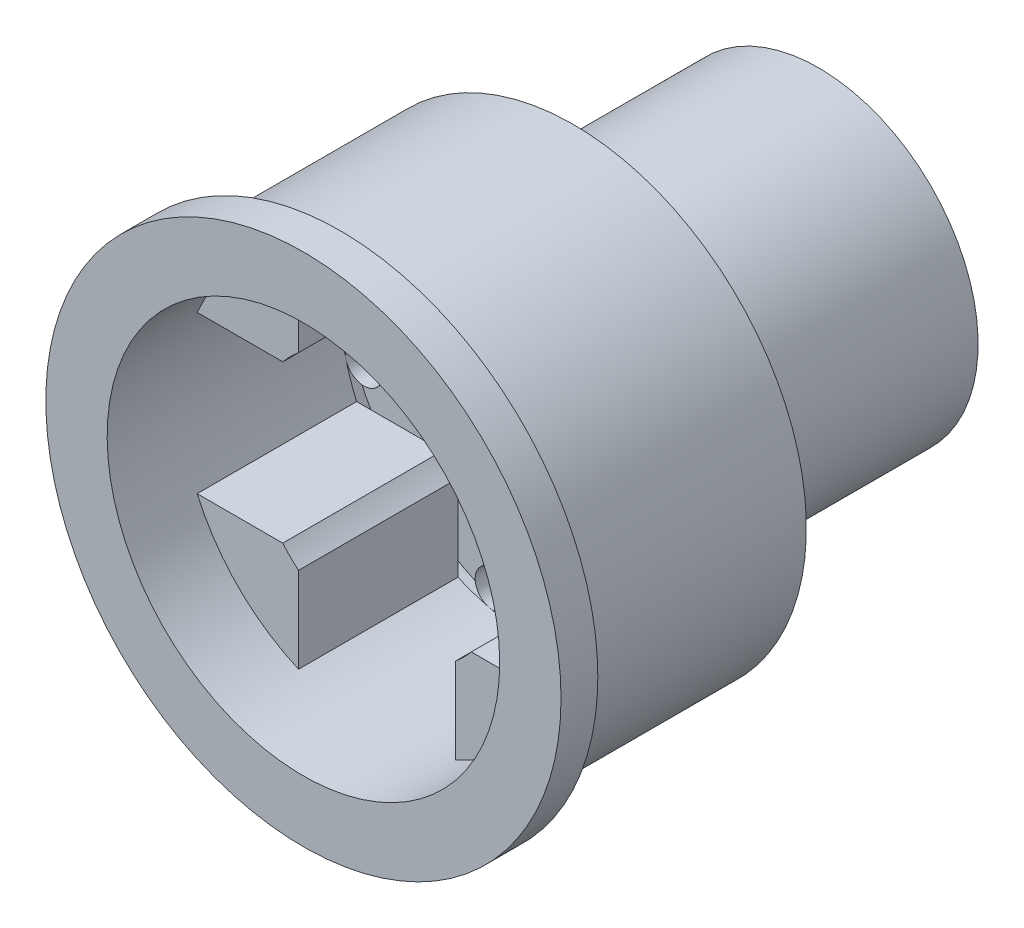
ISO-10303-21;
HEADER;
FILE_DESCRIPTION(('STEP AP214'),'2;1');
FILE_NAME('part.step','',(''),(''),'','','');
FILE_SCHEMA(('AUTOMOTIVE_DESIGN { 1 0 10303 214 1 1 1 1 }'));
ENDSEC;
DATA;
#1=APPLICATION_CONTEXT('core data for automotive mechanical design processes');
#2=APPLICATION_PROTOCOL_DEFINITION('international standard','automotive_design',2000,#1);
#3=PRODUCT_CONTEXT('',#1,'mechanical');
#4=PRODUCT('Part','Part','',(#3));
#5=PRODUCT_RELATED_PRODUCT_CATEGORY('part','',(#4));
#6=PRODUCT_DEFINITION_FORMATION('','',#4);
#7=PRODUCT_DEFINITION_CONTEXT('part definition',#1,'design');
#8=PRODUCT_DEFINITION('design','',#6,#7);
#9=PRODUCT_DEFINITION_SHAPE('','',#8);
#10=(LENGTH_UNIT() NAMED_UNIT(*) SI_UNIT(.MILLI.,.METRE.));
#11=(NAMED_UNIT(*) PLANE_ANGLE_UNIT() SI_UNIT($,.RADIAN.));
#12=(NAMED_UNIT(*) SI_UNIT($,.STERADIAN.) SOLID_ANGLE_UNIT());
#13=UNCERTAINTY_MEASURE_WITH_UNIT(LENGTH_MEASURE(1.E-05),#10,'distance_accuracy_value','');
#14=(GEOMETRIC_REPRESENTATION_CONTEXT(3) GLOBAL_UNCERTAINTY_ASSIGNED_CONTEXT((#13)) GLOBAL_UNIT_ASSIGNED_CONTEXT((#10,
#11,#12)) REPRESENTATION_CONTEXT('',''));
#15=CARTESIAN_POINT('',(0.,0.,0.));
#16=DIRECTION('',(0.,0.,1.));
#17=DIRECTION('',(1.,0.,0.));
#18=AXIS2_PLACEMENT_3D('',#15,#16,#17);
#19=CARTESIAN_POINT('',(0.,0.,-8.));
#20=DIRECTION('',(0.,0.,1.));
#21=DIRECTION('',(1.,0.,0.));
#22=AXIS2_PLACEMENT_3D('',#19,#20,#21);
#23=CYLINDRICAL_SURFACE('',#22,5.);
#24=CARTESIAN_POINT('',(0.,0.,-6.5));
#25=DIRECTION('',(0.,0.,-1.));
#26=DIRECTION('',(-1.,0.,0.));
#27=AXIS2_PLACEMENT_3D('',#24,#25,#26);
#28=CIRCLE('',#27,5.);
#29=CARTESIAN_POINT('',(-3.2,3.84187454245971,-6.5));
#30=VERTEX_POINT('',#29);
#31=CARTESIAN_POINT('',(3.2,3.84187454245971,-6.5));
#32=VERTEX_POINT('',#31);
#33=EDGE_CURVE('E341',#30,#32,#28,.T.);
#34=ORIENTED_EDGE('',*,*,#33,.F.);
#35=DIRECTION('',(0.,0.,-1.));
#36=VECTOR('',#35,1.);
#37=CARTESIAN_POINT('',(-3.2,3.84187454245971,3.));
#38=LINE('',#37,#36);
#39=CARTESIAN_POINT('',(-3.2,3.84187454245971,0.));
#40=VERTEX_POINT('',#39);
#41=EDGE_CURVE('E328',#30,#40,#38,.F.);
#42=ORIENTED_EDGE('',*,*,#41,.T.);
#43=CARTESIAN_POINT('',(0.,0.,0.));
#44=DIRECTION('',(0.,0.,-1.));
#45=DIRECTION('',(-1.,0.,0.));
#46=AXIS2_PLACEMENT_3D('',#43,#44,#45);
#47=CIRCLE('',#46,5.);
#48=CARTESIAN_POINT('',(-3.84187454245971,3.2,0.));
#49=VERTEX_POINT('',#48);
#50=EDGE_CURVE('E325',#49,#40,#47,.T.);
#51=ORIENTED_EDGE('',*,*,#50,.F.);
#52=DIRECTION('',(0.,0.,-1.));
#53=VECTOR('',#52,1.);
#54=CARTESIAN_POINT('',(-3.84187454245971,3.2,3.));
#55=LINE('',#54,#53);
#56=CARTESIAN_POINT('',(-3.84187454245971,3.2,-6.5));
#57=VERTEX_POINT('',#56);
#58=EDGE_CURVE('E323',#49,#57,#55,.T.);
#59=ORIENTED_EDGE('',*,*,#58,.T.);
#60=CARTESIAN_POINT('',(-3.84187454245971,-3.2,-6.5));
#61=VERTEX_POINT('',#60);
#62=EDGE_CURVE('E337',#61,#57,#28,.T.);
#63=ORIENTED_EDGE('',*,*,#62,.F.);
#64=DIRECTION('',(0.,0.,-1.));
#65=VECTOR('',#64,1.);
#66=CARTESIAN_POINT('',(-3.84187454245971,-3.2,3.));
#67=LINE('',#66,#65);
#68=CARTESIAN_POINT('',(-3.84187454245971,-3.2,0.));
#69=VERTEX_POINT('',#68);
#70=EDGE_CURVE('E319',#61,#69,#67,.F.);
#71=ORIENTED_EDGE('',*,*,#70,.T.);
#72=CARTESIAN_POINT('',(0.,0.,0.));
#73=DIRECTION('',(0.,0.,-1.));
#74=DIRECTION('',(-1.,0.,0.));
#75=AXIS2_PLACEMENT_3D('',#72,#73,#74);
#76=CIRCLE('',#75,5.);
#77=CARTESIAN_POINT('',(-3.2,-3.84187454245971,0.));
#78=VERTEX_POINT('',#77);
#79=EDGE_CURVE('E316',#78,#69,#76,.T.);
#80=ORIENTED_EDGE('',*,*,#79,.F.);
#81=DIRECTION('',(0.,0.,-1.));
#82=VECTOR('',#81,1.);
#83=CARTESIAN_POINT('',(-3.2,-3.84187454245971,3.));
#84=LINE('',#83,#82);
#85=CARTESIAN_POINT('',(-3.2,-3.84187454245971,-6.5));
#86=VERTEX_POINT('',#85);
#87=EDGE_CURVE('E304',#78,#86,#84,.T.);
#88=ORIENTED_EDGE('',*,*,#87,.T.);
#89=CARTESIAN_POINT('',(3.2,-3.84187454245971,-6.5));
#90=VERTEX_POINT('',#89);
#91=EDGE_CURVE('E340',#90,#86,#28,.T.);
#92=ORIENTED_EDGE('',*,*,#91,.F.);
#93=DIRECTION('',(0.,0.,-1.));
#94=VECTOR('',#93,1.);
#95=CARTESIAN_POINT('',(3.2,-3.84187454245971,3.));
#96=LINE('',#95,#94);
#97=CARTESIAN_POINT('',(3.2,-3.84187454245971,0.));
#98=VERTEX_POINT('',#97);
#99=EDGE_CURVE('E311',#90,#98,#96,.F.);
#100=ORIENTED_EDGE('',*,*,#99,.T.);
#101=CARTESIAN_POINT('',(0.,0.,0.));
#102=DIRECTION('',(0.,0.,-1.));
#103=DIRECTION('',(-1.,0.,0.));
#104=AXIS2_PLACEMENT_3D('',#101,#102,#103);
#105=CIRCLE('',#104,5.);
#106=CARTESIAN_POINT('',(3.84187454245971,-3.2,0.));
#107=VERTEX_POINT('',#106);
#108=EDGE_CURVE('E313',#107,#98,#105,.T.);
#109=ORIENTED_EDGE('',*,*,#108,.F.);
#110=DIRECTION('',(0.,0.,-1.));
#111=VECTOR('',#110,1.);
#112=CARTESIAN_POINT('',(3.84187454245971,-3.2,3.));
#113=LINE('',#112,#111);
#114=CARTESIAN_POINT('',(3.84187454245971,-3.2,-6.5));
#115=VERTEX_POINT('',#114);
#116=EDGE_CURVE('E321',#107,#115,#113,.T.);
#117=ORIENTED_EDGE('',*,*,#116,.T.);
#118=CARTESIAN_POINT('',(3.84187454245971,3.2,-6.5));
#119=VERTEX_POINT('',#118);
#120=EDGE_CURVE('E476',#119,#115,#28,.T.);
#121=ORIENTED_EDGE('',*,*,#120,.F.);
#122=DIRECTION('',(0.,0.,-1.));
#123=VECTOR('',#122,1.);
#124=CARTESIAN_POINT('',(3.84187454245971,3.2,3.));
#125=LINE('',#124,#123);
#126=CARTESIAN_POINT('',(3.84187454245971,3.2,0.));
#127=VERTEX_POINT('',#126);
#128=EDGE_CURVE('E335',#119,#127,#125,.F.);
#129=ORIENTED_EDGE('',*,*,#128,.T.);
#130=CARTESIAN_POINT('',(0.,0.,0.));
#131=DIRECTION('',(0.,0.,-1.));
#132=DIRECTION('',(-1.,0.,0.));
#133=AXIS2_PLACEMENT_3D('',#130,#131,#132);
#134=CIRCLE('',#133,5.);
#135=CARTESIAN_POINT('',(3.2,3.84187454245971,0.));
#136=VERTEX_POINT('',#135);
#137=EDGE_CURVE('E332',#136,#127,#134,.T.);
#138=ORIENTED_EDGE('',*,*,#137,.F.);
#139=DIRECTION('',(0.,0.,-1.));
#140=VECTOR('',#139,1.);
#141=CARTESIAN_POINT('',(3.2,3.84187454245971,3.));
#142=LINE('',#141,#140);
#143=EDGE_CURVE('E330',#136,#32,#142,.T.);
#144=ORIENTED_EDGE('',*,*,#143,.T.);
#145=EDGE_LOOP('',(#34,#42,#51,#59,#63,#71,#80,#88,#92,#100,#109,#117,#121,#129,#138,#144));
#146=FACE_BOUND('',#145,.T.);
#147=CARTESIAN_POINT('',(0.,0.,-16.5));
#148=DIRECTION('',(0.,0.,-1.));
#149=DIRECTION('',(-1.,0.,0.));
#150=AXIS2_PLACEMENT_3D('',#147,#148,#149);
#151=CIRCLE('',#150,5.);
#152=CARTESIAN_POINT('',(-5.,0.,-16.5));
#153=VERTEX_POINT('',#152);
#154=EDGE_CURVE('E261',#153,#153,#151,.T.);
#155=ORIENTED_EDGE('',*,*,#154,.T.);
#156=EDGE_LOOP('',(#155));
#157=FACE_BOUND('',#156,.T.);
#158=ADVANCED_FACE('F34',(#146,#157),#23,.F.);
#159=CARTESIAN_POINT('',(0.,0.,1.5));
#160=DIRECTION('',(0.,0.,-1.));
#161=DIRECTION('',(-1.,0.,0.));
#162=AXIS2_PLACEMENT_3D('',#159,#160,#161);
#163=CYLINDRICAL_SURFACE('',#162,9.5);
#164=CARTESIAN_POINT('',(0.,0.,1.5));
#165=DIRECTION('',(0.,0.,1.));
#166=DIRECTION('',(1.,0.,0.));
#167=AXIS2_PLACEMENT_3D('',#164,#165,#166);
#168=CIRCLE('',#167,9.5);
#169=CARTESIAN_POINT('',(9.5,0.,1.5));
#170=VERTEX_POINT('',#169);
#171=EDGE_CURVE('E38',#170,#170,#168,.T.);
#172=ORIENTED_EDGE('',*,*,#171,.F.);
#173=EDGE_LOOP('',(#172));
#174=FACE_BOUND('',#173,.T.);
#175=CARTESIAN_POINT('',(0.,0.,-8.));
#176=DIRECTION('',(0.,0.,-1.));
#177=DIRECTION('',(-1.,0.,0.));
#178=AXIS2_PLACEMENT_3D('',#175,#176,#177);
#179=CIRCLE('',#178,9.5);
#180=CARTESIAN_POINT('',(-9.5,0.,-8.));
#181=VERTEX_POINT('',#180);
#182=EDGE_CURVE('E342',#181,#181,#179,.T.);
#183=ORIENTED_EDGE('',*,*,#182,.F.);
#184=EDGE_LOOP('',(#183));
#185=FACE_BOUND('',#184,.T.);
#186=ADVANCED_FACE('F36',(#174,#185),#163,.T.);
#187=CARTESIAN_POINT('',(0.,0.,1.5));
#188=DIRECTION('',(0.,0.,-1.));
#189=DIRECTION('',(-1.,0.,0.));
#190=AXIS2_PLACEMENT_3D('',#187,#188,#189);
#191=CYLINDRICAL_SURFACE('',#190,8.);
#192=CARTESIAN_POINT('',(0.,0.,0.));
#193=DIRECTION('',(0.,0.,1.));
#194=DIRECTION('',(1.,0.,0.));
#195=AXIS2_PLACEMENT_3D('',#192,#193,#194);
#196=CIRCLE('',#195,8.);
#197=CARTESIAN_POINT('',(7.33212111192934,3.2,0.));
#198=VERTEX_POINT('',#197);
#199=CARTESIAN_POINT('',(3.2,7.33212111192934,0.));
#200=VERTEX_POINT('',#199);
#201=EDGE_CURVE('E442',#198,#200,#196,.T.);
#202=ORIENTED_EDGE('',*,*,#201,.F.);
#203=DIRECTION('',(0.,0.,1.));
#204=VECTOR('',#203,1.);
#205=CARTESIAN_POINT('',(7.33212111192934,3.2,-6.5));
#206=LINE('',#205,#204);
#207=CARTESIAN_POINT('',(7.33212111192934,3.2,-6.5));
#208=VERTEX_POINT('',#207);
#209=EDGE_CURVE('E390',#208,#198,#206,.T.);
#210=ORIENTED_EDGE('',*,*,#209,.F.);
#211=CARTESIAN_POINT('',(0.,0.,-6.5));
#212=DIRECTION('',(0.,0.,-1.));
#213=DIRECTION('',(-1.,0.,0.));
#214=AXIS2_PLACEMENT_3D('',#211,#212,#213);
#215=CIRCLE('',#214,8.);
#216=CARTESIAN_POINT('',(7.76344677488016,1.93103448275862,-6.5));
#217=VERTEX_POINT('',#216);
#218=EDGE_CURVE('E346',#208,#217,#215,.T.);
#219=ORIENTED_EDGE('',*,*,#218,.T.);
#220=CARTESIAN_POINT('',(7.76344677488016,-1.93103448275862,-6.5));
#221=VERTEX_POINT('',#220);
#222=EDGE_CURVE('E350',#217,#221,#215,.T.);
#223=ORIENTED_EDGE('',*,*,#222,.T.);
#224=CARTESIAN_POINT('',(7.33212111192934,-3.2,-6.5));
#225=VERTEX_POINT('',#224);
#226=EDGE_CURVE('E351',#221,#225,#215,.T.);
#227=ORIENTED_EDGE('',*,*,#226,.T.);
#228=DIRECTION('',(0.,0.,1.));
#229=VECTOR('',#228,1.);
#230=CARTESIAN_POINT('',(7.33212111192934,-3.2,-6.5));
#231=LINE('',#230,#229);
#232=CARTESIAN_POINT('',(7.33212111192934,-3.2,0.));
#233=VERTEX_POINT('',#232);
#234=EDGE_CURVE('E430',#225,#233,#231,.T.);
#235=ORIENTED_EDGE('',*,*,#234,.T.);
#236=CARTESIAN_POINT('',(3.2,-7.33212111192934,0.));
#237=VERTEX_POINT('',#236);
#238=EDGE_CURVE('E440',#237,#233,#196,.T.);
#239=ORIENTED_EDGE('',*,*,#238,.F.);
#240=DIRECTION('',(0.,0.,1.));
#241=VECTOR('',#240,1.);
#242=CARTESIAN_POINT('',(3.2,-7.33212111192934,-6.5));
#243=LINE('',#242,#241);
#244=CARTESIAN_POINT('',(3.2,-7.33212111192934,-6.5));
#245=VERTEX_POINT('',#244);
#246=EDGE_CURVE('E427',#245,#237,#243,.T.);
#247=ORIENTED_EDGE('',*,*,#246,.F.);
#248=CARTESIAN_POINT('',(0.,0.,-6.5));
#249=DIRECTION('',(0.,0.,-1.));
#250=DIRECTION('',(-1.,0.,0.));
#251=AXIS2_PLACEMENT_3D('',#248,#249,#250);
#252=CIRCLE('',#251,8.);
#253=CARTESIAN_POINT('',(1.9310344827587,-7.76344677488014,-6.5));
#254=VERTEX_POINT('',#253);
#255=EDGE_CURVE('E358',#245,#254,#252,.T.);
#256=ORIENTED_EDGE('',*,*,#255,.T.);
#257=CARTESIAN_POINT('',(-1.93103448275854,-7.76344677488018,-6.5));
#258=VERTEX_POINT('',#257);
#259=EDGE_CURVE('E362',#254,#258,#252,.T.);
#260=ORIENTED_EDGE('',*,*,#259,.T.);
#261=CARTESIAN_POINT('',(-3.2,-7.33212111192934,-6.5));
#262=VERTEX_POINT('',#261);
#263=EDGE_CURVE('E357',#258,#262,#252,.T.);
#264=ORIENTED_EDGE('',*,*,#263,.T.);
#265=DIRECTION('',(0.,0.,1.));
#266=VECTOR('',#265,1.);
#267=CARTESIAN_POINT('',(-3.2,-7.33212111192934,-6.5));
#268=LINE('',#267,#266);
#269=CARTESIAN_POINT('',(-3.2,-7.33212111192934,0.));
#270=VERTEX_POINT('',#269);
#271=EDGE_CURVE('E424',#262,#270,#268,.T.);
#272=ORIENTED_EDGE('',*,*,#271,.T.);
#273=CARTESIAN_POINT('',(-7.33212111192934,-3.2,0.));
#274=VERTEX_POINT('',#273);
#275=EDGE_CURVE('E447',#274,#270,#196,.T.);
#276=ORIENTED_EDGE('',*,*,#275,.F.);
#277=DIRECTION('',(0.,0.,1.));
#278=VECTOR('',#277,1.);
#279=CARTESIAN_POINT('',(-7.33212111192934,-3.2,-6.5));
#280=LINE('',#279,#278);
#281=CARTESIAN_POINT('',(-7.33212111192934,-3.2,-6.5));
#282=VERTEX_POINT('',#281);
#283=EDGE_CURVE('E421',#282,#274,#280,.T.);
#284=ORIENTED_EDGE('',*,*,#283,.F.);
#285=CARTESIAN_POINT('',(0.,0.,-6.5));
#286=DIRECTION('',(0.,0.,-1.));
#287=DIRECTION('',(-1.,0.,0.));
#288=AXIS2_PLACEMENT_3D('',#285,#286,#287);
#289=CIRCLE('',#288,8.);
#290=CARTESIAN_POINT('',(-7.76344677488016,-1.93103448275862,-6.5));
#291=VERTEX_POINT('',#290);
#292=EDGE_CURVE('E369',#282,#291,#289,.T.);
#293=ORIENTED_EDGE('',*,*,#292,.T.);
#294=CARTESIAN_POINT('',(-7.76344677488016,1.93103448275862,-6.5));
#295=VERTEX_POINT('',#294);
#296=EDGE_CURVE('E373',#291,#295,#289,.T.);
#297=ORIENTED_EDGE('',*,*,#296,.T.);
#298=CARTESIAN_POINT('',(-7.33212111192934,3.2,-6.5));
#299=VERTEX_POINT('',#298);
#300=EDGE_CURVE('E368',#295,#299,#289,.T.);
#301=ORIENTED_EDGE('',*,*,#300,.T.);
#302=DIRECTION('',(0.,0.,1.));
#303=VECTOR('',#302,1.);
#304=CARTESIAN_POINT('',(-7.33212111192934,3.2,-6.5));
#305=LINE('',#304,#303);
#306=CARTESIAN_POINT('',(-7.33212111192934,3.2,0.));
#307=VERTEX_POINT('',#306);
#308=EDGE_CURVE('E418',#299,#307,#305,.T.);
#309=ORIENTED_EDGE('',*,*,#308,.T.);
#310=CARTESIAN_POINT('',(-3.2,7.33212111192934,0.));
#311=VERTEX_POINT('',#310);
#312=EDGE_CURVE('E443',#311,#307,#196,.T.);
#313=ORIENTED_EDGE('',*,*,#312,.F.);
#314=DIRECTION('',(0.,0.,1.));
#315=VECTOR('',#314,1.);
#316=CARTESIAN_POINT('',(-3.2,7.33212111192934,-6.5));
#317=LINE('',#316,#315);
#318=CARTESIAN_POINT('',(-3.2,7.33212111192934,-6.5));
#319=VERTEX_POINT('',#318);
#320=EDGE_CURVE('E415',#319,#311,#317,.T.);
#321=ORIENTED_EDGE('',*,*,#320,.F.);
#322=CARTESIAN_POINT('',(0.,0.,-6.5));
#323=DIRECTION('',(0.,0.,-1.));
#324=DIRECTION('',(-1.,0.,0.));
#325=AXIS2_PLACEMENT_3D('',#322,#323,#324);
#326=CIRCLE('',#325,8.);
#327=CARTESIAN_POINT('',(-1.93103448275865,7.76344677488015,-6.5));
#328=VERTEX_POINT('',#327);
#329=EDGE_CURVE('E380',#319,#328,#326,.T.);
#330=ORIENTED_EDGE('',*,*,#329,.T.);
#331=CARTESIAN_POINT('',(1.93103448275859,7.76344677488017,-6.5));
#332=VERTEX_POINT('',#331);
#333=EDGE_CURVE('E384',#328,#332,#326,.T.);
#334=ORIENTED_EDGE('',*,*,#333,.T.);
#335=CARTESIAN_POINT('',(3.2,7.33212111192934,-6.5));
#336=VERTEX_POINT('',#335);
#337=EDGE_CURVE('E379',#332,#336,#326,.T.);
#338=ORIENTED_EDGE('',*,*,#337,.T.);
#339=DIRECTION('',(0.,0.,1.));
#340=VECTOR('',#339,1.);
#341=CARTESIAN_POINT('',(3.2,7.33212111192934,-6.5));
#342=LINE('',#341,#340);
#343=EDGE_CURVE('E412',#336,#200,#342,.T.);
#344=ORIENTED_EDGE('',*,*,#343,.T.);
#345=EDGE_LOOP('',(#202,#210,#219,#223,#227,#235,#239,#247,#256,#260,#264,#272,#276,#284,#293,
#297,#301,#309,#313,#321,#330,#334,#338,#344));
#346=FACE_BOUND('',#345,.T.);
#347=CARTESIAN_POINT('',(0.,0.,3.));
#348=DIRECTION('',(0.,0.,1.));
#349=DIRECTION('',(1.,0.,0.));
#350=AXIS2_PLACEMENT_3D('',#347,#348,#349);
#351=CIRCLE('',#350,8.);
#352=CARTESIAN_POINT('',(8.,0.,3.));
#353=VERTEX_POINT('',#352);
#354=EDGE_CURVE('E433',#353,#353,#351,.T.);
#355=ORIENTED_EDGE('',*,*,#354,.T.);
#356=EDGE_LOOP('',(#355));
#357=FACE_BOUND('',#356,.T.);
#358=ADVANCED_FACE('F459',(#346,#357),#191,.F.);
#359=CARTESIAN_POINT('',(0.,0.,3.));
#360=DIRECTION('',(0.,0.,1.));
#361=DIRECTION('',(1.,0.,0.));
#362=AXIS2_PLACEMENT_3D('',#359,#360,#361);
#363=PLANE('',#362);
#364=CARTESIAN_POINT('',(0.,0.,3.));
#365=DIRECTION('',(0.,0.,1.));
#366=DIRECTION('',(1.,0.,0.));
#367=AXIS2_PLACEMENT_3D('',#364,#365,#366);
#368=CIRCLE('',#367,10.5);
#369=CARTESIAN_POINT('',(10.5,0.,3.));
#370=VERTEX_POINT('',#369);
#371=EDGE_CURVE('E437',#370,#370,#368,.T.);
#372=ORIENTED_EDGE('',*,*,#371,.T.);
#373=EDGE_LOOP('',(#372));
#374=FACE_BOUND('',#373,.T.);
#375=ORIENTED_EDGE('',*,*,#354,.F.);
#376=EDGE_LOOP('',(#375));
#377=FACE_BOUND('',#376,.T.);
#378=ADVANCED_FACE('F568',(#374,#377),#363,.T.);
#379=CARTESIAN_POINT('',(0.,0.,1.5));
#380=DIRECTION('',(0.,0.,1.));
#381=DIRECTION('',(1.,0.,0.));
#382=AXIS2_PLACEMENT_3D('',#379,#380,#381);
#383=PLANE('',#382);
#384=ORIENTED_EDGE('',*,*,#171,.T.);
#385=EDGE_LOOP('',(#384));
#386=FACE_BOUND('',#385,.T.);
#387=CARTESIAN_POINT('',(0.,0.,1.5));
#388=DIRECTION('',(0.,0.,1.));
#389=DIRECTION('',(1.,0.,0.));
#390=AXIS2_PLACEMENT_3D('',#387,#388,#389);
#391=CIRCLE('',#390,10.5);
#392=CARTESIAN_POINT('',(10.5,0.,1.5));
#393=VERTEX_POINT('',#392);
#394=EDGE_CURVE('E436',#393,#393,#391,.T.);
#395=ORIENTED_EDGE('',*,*,#394,.F.);
#396=EDGE_LOOP('',(#395));
#397=FACE_BOUND('',#396,.T.);
#398=ADVANCED_FACE('F571',(#386,#397),#383,.F.);
#399=CARTESIAN_POINT('',(0.,0.,3.));
#400=DIRECTION('',(0.,0.,-1.));
#401=DIRECTION('',(-1.,0.,0.));
#402=AXIS2_PLACEMENT_3D('',#399,#400,#401);
#403=CYLINDRICAL_SURFACE('',#402,10.5);
#404=ORIENTED_EDGE('',*,*,#371,.F.);
#405=EDGE_LOOP('',(#404));
#406=FACE_BOUND('',#405,.T.);
#407=ORIENTED_EDGE('',*,*,#394,.T.);
#408=EDGE_LOOP('',(#407));
#409=FACE_BOUND('',#408,.T.);
#410=ADVANCED_FACE('F567',(#406,#409),#403,.T.);
#411=CARTESIAN_POINT('',(0.,0.,0.));
#412=DIRECTION('',(0.,0.,-1.));
#413=DIRECTION('',(-1.,0.,0.));
#414=AXIS2_PLACEMENT_3D('',#411,#412,#413);
#415=PLANE('',#414);
#416=DIRECTION('',(0.,-1.,0.));
#417=VECTOR('',#416,1.);
#418=CARTESIAN_POINT('',(3.2,3.2,0.));
#419=LINE('',#418,#417);
#420=EDGE_CURVE('E405',#200,#136,#419,.T.);
#421=ORIENTED_EDGE('',*,*,#420,.T.);
#422=ORIENTED_EDGE('',*,*,#137,.T.);
#423=DIRECTION('',(1.,0.,0.));
#424=VECTOR('',#423,1.);
#425=CARTESIAN_POINT('',(7.33212111192934,3.2,0.));
#426=LINE('',#425,#424);
#427=EDGE_CURVE('E408',#127,#198,#426,.T.);
#428=ORIENTED_EDGE('',*,*,#427,.T.);
#429=ORIENTED_EDGE('',*,*,#201,.T.);
#430=EDGE_LOOP('',(#421,#422,#428,#429));
#431=FACE_BOUND('',#430,.T.);
#432=ADVANCED_FACE('F563',(#431),#415,.F.);
#433=DIRECTION('',(1.,0.,0.));
#434=VECTOR('',#433,1.);
#435=CARTESIAN_POINT('',(-3.2,3.2,0.));
#436=LINE('',#435,#434);
#437=EDGE_CURVE('E400',#307,#49,#436,.T.);
#438=ORIENTED_EDGE('',*,*,#437,.T.);
#439=ORIENTED_EDGE('',*,*,#50,.T.);
#440=DIRECTION('',(0.,1.,0.));
#441=VECTOR('',#440,1.);
#442=CARTESIAN_POINT('',(-3.2,7.33212111192934,0.));
#443=LINE('',#442,#441);
#444=EDGE_CURVE('E403',#40,#311,#443,.T.);
#445=ORIENTED_EDGE('',*,*,#444,.T.);
#446=ORIENTED_EDGE('',*,*,#312,.T.);
#447=EDGE_LOOP('',(#438,#439,#445,#446));
#448=FACE_BOUND('',#447,.T.);
#449=ADVANCED_FACE('F566',(#448),#415,.F.);
#450=DIRECTION('',(0.,1.,0.));
#451=VECTOR('',#450,1.);
#452=CARTESIAN_POINT('',(-3.2,-3.2,0.));
#453=LINE('',#452,#451);
#454=EDGE_CURVE('E395',#270,#78,#453,.T.);
#455=ORIENTED_EDGE('',*,*,#454,.T.);
#456=ORIENTED_EDGE('',*,*,#79,.T.);
#457=DIRECTION('',(-1.,0.,0.));
#458=VECTOR('',#457,1.);
#459=CARTESIAN_POINT('',(-7.33212111192934,-3.2,0.));
#460=LINE('',#459,#458);
#461=EDGE_CURVE('E398',#69,#274,#460,.T.);
#462=ORIENTED_EDGE('',*,*,#461,.T.);
#463=ORIENTED_EDGE('',*,*,#275,.T.);
#464=EDGE_LOOP('',(#455,#456,#462,#463));
#465=FACE_BOUND('',#464,.T.);
#466=ADVANCED_FACE('F453',(#465),#415,.F.);
#467=DIRECTION('',(-1.,0.,0.));
#468=VECTOR('',#467,1.);
#469=CARTESIAN_POINT('',(3.2,-3.2,0.));
#470=LINE('',#469,#468);
#471=EDGE_CURVE('E345',#233,#107,#470,.T.);
#472=ORIENTED_EDGE('',*,*,#471,.T.);
#473=ORIENTED_EDGE('',*,*,#108,.T.);
#474=DIRECTION('',(0.,-1.,0.));
#475=VECTOR('',#474,1.);
#476=CARTESIAN_POINT('',(3.2,-7.33212111192934,0.));
#477=LINE('',#476,#475);
#478=EDGE_CURVE('E393',#98,#237,#477,.T.);
#479=ORIENTED_EDGE('',*,*,#478,.T.);
#480=ORIENTED_EDGE('',*,*,#238,.T.);
#481=EDGE_LOOP('',(#472,#473,#479,#480));
#482=FACE_BOUND('',#481,.T.);
#483=ADVANCED_FACE('F561',(#482),#415,.F.);
#484=CARTESIAN_POINT('',(3.2,-3.2,-6.5));
#485=DIRECTION('',(0.,1.,0.));
#486=DIRECTION('',(-1.,0.,0.));
#487=AXIS2_PLACEMENT_3D('',#484,#485,#486);
#488=PLANE('',#487);
#489=ORIENTED_EDGE('',*,*,#116,.F.);
#490=ORIENTED_EDGE('',*,*,#471,.F.);
#491=ORIENTED_EDGE('',*,*,#234,.F.);
#492=DIRECTION('',(-1.,0.,0.));
#493=VECTOR('',#492,1.);
#494=CARTESIAN_POINT('',(3.2,-3.2,-6.5));
#495=LINE('',#494,#493);
#496=EDGE_CURVE('E349',#225,#115,#495,.T.);
#497=ORIENTED_EDGE('',*,*,#496,.T.);
#498=EDGE_LOOP('',(#489,#490,#491,#497));
#499=FACE_BOUND('',#498,.T.);
#500=ADVANCED_FACE('F557',(#499),#488,.T.);
#501=CARTESIAN_POINT('',(3.2,-7.33212111192934,-6.5));
#502=DIRECTION('',(-1.,0.,0.));
#503=DIRECTION('',(0.,-1.,0.));
#504=AXIS2_PLACEMENT_3D('',#501,#502,#503);
#505=PLANE('',#504);
#506=ORIENTED_EDGE('',*,*,#99,.F.);
#507=DIRECTION('',(0.,-1.,0.));
#508=VECTOR('',#507,1.);
#509=CARTESIAN_POINT('',(3.2,-7.33212111192934,-6.5));
#510=LINE('',#509,#508);
#511=EDGE_CURVE('E354',#90,#245,#510,.T.);
#512=ORIENTED_EDGE('',*,*,#511,.T.);
#513=ORIENTED_EDGE('',*,*,#246,.T.);
#514=ORIENTED_EDGE('',*,*,#478,.F.);
#515=EDGE_LOOP('',(#506,#512,#513,#514));
#516=FACE_BOUND('',#515,.T.);
#517=ADVANCED_FACE('F554',(#516),#505,.T.);
#518=CARTESIAN_POINT('',(-3.2,-3.2,-6.5));
#519=DIRECTION('',(1.,0.,0.));
#520=DIRECTION('',(0.,1.,0.));
#521=AXIS2_PLACEMENT_3D('',#518,#519,#520);
#522=PLANE('',#521);
#523=ORIENTED_EDGE('',*,*,#87,.F.);
#524=ORIENTED_EDGE('',*,*,#454,.F.);
#525=ORIENTED_EDGE('',*,*,#271,.F.);
#526=DIRECTION('',(0.,1.,0.));
#527=VECTOR('',#526,1.);
#528=CARTESIAN_POINT('',(-3.2,-3.2,-6.5));
#529=LINE('',#528,#527);
#530=EDGE_CURVE('E361',#262,#86,#529,.T.);
#531=ORIENTED_EDGE('',*,*,#530,.T.);
#532=EDGE_LOOP('',(#523,#524,#525,#531));
#533=FACE_BOUND('',#532,.T.);
#534=ADVANCED_FACE('F466',(#533),#522,.T.);
#535=CARTESIAN_POINT('',(-7.33212111192934,-3.2,-6.5));
#536=DIRECTION('',(0.,1.,0.));
#537=DIRECTION('',(-1.,0.,0.));
#538=AXIS2_PLACEMENT_3D('',#535,#536,#537);
#539=PLANE('',#538);
#540=ORIENTED_EDGE('',*,*,#70,.F.);
#541=DIRECTION('',(-1.,0.,0.));
#542=VECTOR('',#541,1.);
#543=CARTESIAN_POINT('',(-7.33212111192934,-3.2,-6.5));
#544=LINE('',#543,#542);
#545=EDGE_CURVE('E365',#61,#282,#544,.T.);
#546=ORIENTED_EDGE('',*,*,#545,.T.);
#547=ORIENTED_EDGE('',*,*,#283,.T.);
#548=ORIENTED_EDGE('',*,*,#461,.F.);
#549=EDGE_LOOP('',(#540,#546,#547,#548));
#550=FACE_BOUND('',#549,.T.);
#551=ADVANCED_FACE('F547',(#550),#539,.T.);
#552=CARTESIAN_POINT('',(-3.2,3.2,-6.5));
#553=DIRECTION('',(0.,-1.,0.));
#554=DIRECTION('',(1.,0.,0.));
#555=AXIS2_PLACEMENT_3D('',#552,#553,#554);
#556=PLANE('',#555);
#557=ORIENTED_EDGE('',*,*,#58,.F.);
#558=ORIENTED_EDGE('',*,*,#437,.F.);
#559=ORIENTED_EDGE('',*,*,#308,.F.);
#560=DIRECTION('',(1.,0.,0.));
#561=VECTOR('',#560,1.);
#562=CARTESIAN_POINT('',(-3.2,3.2,-6.5));
#563=LINE('',#562,#561);
#564=EDGE_CURVE('E372',#299,#57,#563,.T.);
#565=ORIENTED_EDGE('',*,*,#564,.T.);
#566=EDGE_LOOP('',(#557,#558,#559,#565));
#567=FACE_BOUND('',#566,.T.);
#568=ADVANCED_FACE('F543',(#567),#556,.T.);
#569=CARTESIAN_POINT('',(-3.2,7.33212111192934,-6.5));
#570=DIRECTION('',(1.,0.,0.));
#571=DIRECTION('',(0.,1.,0.));
#572=AXIS2_PLACEMENT_3D('',#569,#570,#571);
#573=PLANE('',#572);
#574=ORIENTED_EDGE('',*,*,#41,.F.);
#575=DIRECTION('',(0.,1.,0.));
#576=VECTOR('',#575,1.);
#577=CARTESIAN_POINT('',(-3.2,7.33212111192934,-6.5));
#578=LINE('',#577,#576);
#579=EDGE_CURVE('E376',#30,#319,#578,.T.);
#580=ORIENTED_EDGE('',*,*,#579,.T.);
#581=ORIENTED_EDGE('',*,*,#320,.T.);
#582=ORIENTED_EDGE('',*,*,#444,.F.);
#583=EDGE_LOOP('',(#574,#580,#581,#582));
#584=FACE_BOUND('',#583,.T.);
#585=ADVANCED_FACE('F540',(#584),#573,.T.);
#586=CARTESIAN_POINT('',(3.2,3.2,-6.5));
#587=DIRECTION('',(-1.,0.,0.));
#588=DIRECTION('',(0.,-1.,0.));
#589=AXIS2_PLACEMENT_3D('',#586,#587,#588);
#590=PLANE('',#589);
#591=ORIENTED_EDGE('',*,*,#143,.F.);
#592=ORIENTED_EDGE('',*,*,#420,.F.);
#593=ORIENTED_EDGE('',*,*,#343,.F.);
#594=DIRECTION('',(0.,-1.,0.));
#595=VECTOR('',#594,1.);
#596=CARTESIAN_POINT('',(3.2,3.2,-6.5));
#597=LINE('',#596,#595);
#598=EDGE_CURVE('E383',#336,#32,#597,.T.);
#599=ORIENTED_EDGE('',*,*,#598,.T.);
#600=EDGE_LOOP('',(#591,#592,#593,#599));
#601=FACE_BOUND('',#600,.T.);
#602=ADVANCED_FACE('F491',(#601),#590,.T.);
#603=CARTESIAN_POINT('',(7.33212111192934,3.2,-6.5));
#604=DIRECTION('',(0.,-1.,0.));
#605=DIRECTION('',(1.,0.,0.));
#606=AXIS2_PLACEMENT_3D('',#603,#604,#605);
#607=PLANE('',#606);
#608=ORIENTED_EDGE('',*,*,#128,.F.);
#609=DIRECTION('',(1.,0.,0.));
#610=VECTOR('',#609,1.);
#611=CARTESIAN_POINT('',(7.33212111192934,3.2,-6.5));
#612=LINE('',#611,#610);
#613=EDGE_CURVE('E387',#119,#208,#612,.T.);
#614=ORIENTED_EDGE('',*,*,#613,.T.);
#615=ORIENTED_EDGE('',*,*,#209,.T.);
#616=ORIENTED_EDGE('',*,*,#427,.F.);
#617=EDGE_LOOP('',(#608,#614,#615,#616));
#618=FACE_BOUND('',#617,.T.);
#619=ADVANCED_FACE('F534',(#618),#607,.T.);
#620=CARTESIAN_POINT('',(0.,0.,-6.5));
#621=DIRECTION('',(0.,0.,-1.));
#622=DIRECTION('',(-1.,0.,0.));
#623=AXIS2_PLACEMENT_3D('',#620,#621,#622);
#624=PLANE('',#623);
#625=ORIENTED_EDGE('',*,*,#222,.F.);
#626=CARTESIAN_POINT('',(7.03562363973514,1.75,-6.5));
#627=DIRECTION('',(0.,0.,1.));
#628=DIRECTION('',(1.,0.,0.));
#629=AXIS2_PLACEMENT_3D('',#626,#627,#628);
#630=CIRCLE('',#629,0.75);
#631=EDGE_CURVE('E305',#217,#217,#630,.T.);
#632=ORIENTED_EDGE('',*,*,#631,.F.);
#633=ORIENTED_EDGE('',*,*,#218,.F.);
#634=ORIENTED_EDGE('',*,*,#613,.F.);
#635=ORIENTED_EDGE('',*,*,#120,.T.);
#636=ORIENTED_EDGE('',*,*,#496,.F.);
#637=ORIENTED_EDGE('',*,*,#226,.F.);
#638=CARTESIAN_POINT('',(7.03562363973514,-1.75,-6.5));
#639=DIRECTION('',(0.,0.,1.));
#640=DIRECTION('',(-1.,0.,0.));
#641=AXIS2_PLACEMENT_3D('',#638,#639,#640);
#642=CIRCLE('',#641,0.75);
#643=EDGE_CURVE('E300',#221,#221,#642,.T.);
#644=ORIENTED_EDGE('',*,*,#643,.F.);
#645=EDGE_LOOP('',(#625,#632,#633,#634,#635,#636,#637,#644));
#646=FACE_BOUND('',#645,.T.);
#647=ADVANCED_FACE('F533',(#646),#624,.F.);
#648=ORIENTED_EDGE('',*,*,#337,.F.);
#649=CARTESIAN_POINT('',(1.74999999999997,7.03562363973515,-6.5));
#650=DIRECTION('',(0.,0.,1.));
#651=DIRECTION('',(0.,-1.,0.));
#652=AXIS2_PLACEMENT_3D('',#649,#650,#651);
#653=CIRCLE('',#652,0.75);
#654=EDGE_CURVE('E291',#332,#332,#653,.T.);
#655=ORIENTED_EDGE('',*,*,#654,.F.);
#656=ORIENTED_EDGE('',*,*,#333,.F.);
#657=CARTESIAN_POINT('',(-1.75000000000003,7.03562363973514,-6.5));
#658=DIRECTION('',(0.,0.,1.));
#659=DIRECTION('',(0.,1.,0.));
#660=AXIS2_PLACEMENT_3D('',#657,#658,#659);
#661=CIRCLE('',#660,0.75);
#662=EDGE_CURVE('E290',#328,#328,#661,.T.);
#663=ORIENTED_EDGE('',*,*,#662,.F.);
#664=ORIENTED_EDGE('',*,*,#329,.F.);
#665=ORIENTED_EDGE('',*,*,#579,.F.);
#666=ORIENTED_EDGE('',*,*,#33,.T.);
#667=ORIENTED_EDGE('',*,*,#598,.F.);
#668=EDGE_LOOP('',(#648,#655,#656,#663,#664,#665,#666,#667));
#669=FACE_BOUND('',#668,.T.);
#670=ADVANCED_FACE('F487',(#669),#624,.F.);
#671=ORIENTED_EDGE('',*,*,#300,.F.);
#672=CARTESIAN_POINT('',(-7.03562363973514,1.75,-6.5));
#673=DIRECTION('',(0.,0.,1.));
#674=DIRECTION('',(1.,0.,0.));
#675=AXIS2_PLACEMENT_3D('',#672,#673,#674);
#676=CIRCLE('',#675,0.75);
#677=EDGE_CURVE('E282',#295,#295,#676,.T.);
#678=ORIENTED_EDGE('',*,*,#677,.F.);
#679=ORIENTED_EDGE('',*,*,#296,.F.);
#680=CARTESIAN_POINT('',(-7.03562363973514,-1.75,-6.5));
#681=DIRECTION('',(0.,0.,1.));
#682=DIRECTION('',(-1.,0.,0.));
#683=AXIS2_PLACEMENT_3D('',#680,#681,#682);
#684=CIRCLE('',#683,0.75);
#685=EDGE_CURVE('E281',#291,#291,#684,.T.);
#686=ORIENTED_EDGE('',*,*,#685,.F.);
#687=ORIENTED_EDGE('',*,*,#292,.F.);
#688=ORIENTED_EDGE('',*,*,#545,.F.);
#689=ORIENTED_EDGE('',*,*,#62,.T.);
#690=ORIENTED_EDGE('',*,*,#564,.F.);
#691=EDGE_LOOP('',(#671,#678,#679,#686,#687,#688,#689,#690));
#692=FACE_BOUND('',#691,.T.);
#693=ADVANCED_FACE('F530',(#692),#624,.F.);
#694=CARTESIAN_POINT('',(0.,0.,-8.));
#695=DIRECTION('',(0.,0.,-1.));
#696=DIRECTION('',(-1.,0.,0.));
#697=AXIS2_PLACEMENT_3D('',#694,#695,#696);
#698=PLANE('',#697);
#699=CARTESIAN_POINT('',(0.,0.,-8.));
#700=DIRECTION('',(0.,0.,-1.));
#701=DIRECTION('',(-1.,0.,0.));
#702=AXIS2_PLACEMENT_3D('',#699,#700,#701);
#703=CIRCLE('',#702,6.5);
#704=CARTESIAN_POINT('',(-6.30780050459013,1.56896551724138,-8.));
#705=VERTEX_POINT('',#704);
#706=CARTESIAN_POINT('',(-1.5689655172414,6.30780050459012,-8.));
#707=VERTEX_POINT('',#706);
#708=EDGE_CURVE('E45',#705,#707,#703,.T.);
#709=ORIENTED_EDGE('',*,*,#708,.F.);
#710=CARTESIAN_POINT('',(-7.03562363973514,1.75,-8.));
#711=DIRECTION('',(0.,0.,1.));
#712=DIRECTION('',(1.,0.,0.));
#713=AXIS2_PLACEMENT_3D('',#710,#711,#712);
#714=CIRCLE('',#713,0.75);
#715=EDGE_CURVE('E278',#705,#705,#714,.T.);
#716=ORIENTED_EDGE('',*,*,#715,.T.);
#717=CARTESIAN_POINT('',(-6.30780050459013,-1.56896551724138,-8.));
#718=VERTEX_POINT('',#717);
#719=EDGE_CURVE('E272',#718,#705,#703,.T.);
#720=ORIENTED_EDGE('',*,*,#719,.F.);
#721=CARTESIAN_POINT('',(-7.03562363973514,-1.75,-8.));
#722=DIRECTION('',(0.,0.,1.));
#723=DIRECTION('',(-1.,0.,0.));
#724=AXIS2_PLACEMENT_3D('',#721,#722,#723);
#725=CIRCLE('',#724,0.75);
#726=EDGE_CURVE('E293',#718,#718,#725,.T.);
#727=ORIENTED_EDGE('',*,*,#726,.T.);
#728=CARTESIAN_POINT('',(-1.56896551724131,-6.30780050459015,-8.));
#729=VERTEX_POINT('',#728);
#730=EDGE_CURVE('E835',#729,#718,#703,.T.);
#731=ORIENTED_EDGE('',*,*,#730,.F.);
#732=CARTESIAN_POINT('',(-1.74999999999993,-7.03562363973516,-8.));
#733=DIRECTION('',(0.,0.,1.));
#734=DIRECTION('',(0.,1.,0.));
#735=AXIS2_PLACEMENT_3D('',#732,#733,#734);
#736=CIRCLE('',#735,0.75);
#737=EDGE_CURVE('E273',#729,#729,#736,.T.);
#738=ORIENTED_EDGE('',*,*,#737,.T.);
#739=CARTESIAN_POINT('',(1.56896551724145,-6.30780050459011,-8.));
#740=VERTEX_POINT('',#739);
#741=EDGE_CURVE('E833',#740,#729,#703,.T.);
#742=ORIENTED_EDGE('',*,*,#741,.F.);
#743=CARTESIAN_POINT('',(1.75000000000007,-7.03562363973513,-8.));
#744=DIRECTION('',(0.,0.,1.));
#745=DIRECTION('',(0.,-1.,0.));
#746=AXIS2_PLACEMENT_3D('',#743,#744,#745);
#747=CIRCLE('',#746,0.75);
#748=EDGE_CURVE('E284',#740,#740,#747,.T.);
#749=ORIENTED_EDGE('',*,*,#748,.T.);
#750=CARTESIAN_POINT('',(6.30780050459013,-1.56896551724138,-8.));
#751=VERTEX_POINT('',#750);
#752=EDGE_CURVE('E52',#751,#740,#703,.T.);
#753=ORIENTED_EDGE('',*,*,#752,.F.);
#754=CARTESIAN_POINT('',(7.03562363973514,-1.75,-8.));
#755=DIRECTION('',(0.,0.,1.));
#756=DIRECTION('',(-1.,0.,0.));
#757=AXIS2_PLACEMENT_3D('',#754,#755,#756);
#758=CIRCLE('',#757,0.75);
#759=EDGE_CURVE('E307',#751,#751,#758,.T.);
#760=ORIENTED_EDGE('',*,*,#759,.T.);
#761=CARTESIAN_POINT('',(6.30780050459013,1.56896551724138,-8.));
#762=VERTEX_POINT('',#761);
#763=EDGE_CURVE('E57',#762,#751,#703,.T.);
#764=ORIENTED_EDGE('',*,*,#763,.F.);
#765=CARTESIAN_POINT('',(7.03562363973514,1.75,-8.));
#766=DIRECTION('',(0.,0.,1.));
#767=DIRECTION('',(1.,0.,0.));
#768=AXIS2_PLACEMENT_3D('',#765,#766,#767);
#769=CIRCLE('',#768,0.75);
#770=EDGE_CURVE('E302',#762,#762,#769,.T.);
#771=ORIENTED_EDGE('',*,*,#770,.T.);
#772=CARTESIAN_POINT('',(1.56896551724136,6.30780050459014,-8.));
#773=VERTEX_POINT('',#772);
#774=EDGE_CURVE('E43',#773,#762,#703,.T.);
#775=ORIENTED_EDGE('',*,*,#774,.F.);
#776=CARTESIAN_POINT('',(1.74999999999997,7.03562363973515,-8.));
#777=DIRECTION('',(0.,0.,1.));
#778=DIRECTION('',(0.,-1.,0.));
#779=AXIS2_PLACEMENT_3D('',#776,#777,#778);
#780=CIRCLE('',#779,0.75);
#781=EDGE_CURVE('E287',#773,#773,#780,.T.);
#782=ORIENTED_EDGE('',*,*,#781,.T.);
#783=EDGE_CURVE('E11',#707,#773,#703,.T.);
#784=ORIENTED_EDGE('',*,*,#783,.F.);
#785=CARTESIAN_POINT('',(-1.75000000000003,7.03562363973514,-8.));
#786=DIRECTION('',(0.,0.,1.));
#787=DIRECTION('',(0.,1.,0.));
#788=AXIS2_PLACEMENT_3D('',#785,#786,#787);
#789=CIRCLE('',#788,0.75);
#790=EDGE_CURVE('E297',#707,#707,#789,.T.);
#791=ORIENTED_EDGE('',*,*,#790,.T.);
#792=EDGE_LOOP('',(#709,#716,#720,#727,#731,#738,#742,#749,#753,#760,#764,#771,#775,#782,#784,#791));
#793=FACE_BOUND('',#792,.T.);
#794=ORIENTED_EDGE('',*,*,#182,.T.);
#795=EDGE_LOOP('',(#794));
#796=FACE_BOUND('',#795,.T.);
#797=ADVANCED_FACE('F527',(#793,#796),#698,.T.);
#798=ORIENTED_EDGE('',*,*,#259,.F.);
#799=CARTESIAN_POINT('',(1.75000000000007,-7.03562363973513,-6.5));
#800=DIRECTION('',(0.,0.,1.));
#801=DIRECTION('',(0.,-1.,0.));
#802=AXIS2_PLACEMENT_3D('',#799,#800,#801);
#803=CIRCLE('',#802,0.75);
#804=EDGE_CURVE('E276',#254,#254,#803,.T.);
#805=ORIENTED_EDGE('',*,*,#804,.F.);
#806=ORIENTED_EDGE('',*,*,#255,.F.);
#807=ORIENTED_EDGE('',*,*,#511,.F.);
#808=ORIENTED_EDGE('',*,*,#91,.T.);
#809=ORIENTED_EDGE('',*,*,#530,.F.);
#810=ORIENTED_EDGE('',*,*,#263,.F.);
#811=CARTESIAN_POINT('',(-1.74999999999993,-7.03562363973516,-6.5));
#812=DIRECTION('',(0.,0.,1.));
#813=DIRECTION('',(0.,1.,0.));
#814=AXIS2_PLACEMENT_3D('',#811,#812,#813);
#815=CIRCLE('',#814,0.75);
#816=EDGE_CURVE('E269',#258,#258,#815,.T.);
#817=ORIENTED_EDGE('',*,*,#816,.F.);
#818=EDGE_LOOP('',(#798,#805,#806,#807,#808,#809,#810,#817));
#819=FACE_BOUND('',#818,.T.);
#820=ADVANCED_FACE('F475',(#819),#624,.F.);
#821=CARTESIAN_POINT('',(7.03562363973514,-1.75,-8.));
#822=DIRECTION('',(0.,0.,1.));
#823=DIRECTION('',(1.,0.,0.));
#824=AXIS2_PLACEMENT_3D('',#821,#822,#823);
#825=CYLINDRICAL_SURFACE('',#824,0.75);
#826=ORIENTED_EDGE('',*,*,#759,.F.);
#827=EDGE_LOOP('',(#826));
#828=FACE_BOUND('',#827,.T.);
#829=ORIENTED_EDGE('',*,*,#643,.T.);
#830=EDGE_LOOP('',(#829));
#831=FACE_BOUND('',#830,.T.);
#832=ADVANCED_FACE('F525',(#828,#831),#825,.F.);
#833=CARTESIAN_POINT('',(7.03562363973514,1.75,-8.));
#834=DIRECTION('',(0.,0.,1.));
#835=DIRECTION('',(1.,0.,0.));
#836=AXIS2_PLACEMENT_3D('',#833,#834,#835);
#837=CYLINDRICAL_SURFACE('',#836,0.75);
#838=ORIENTED_EDGE('',*,*,#770,.F.);
#839=EDGE_LOOP('',(#838));
#840=FACE_BOUND('',#839,.T.);
#841=ORIENTED_EDGE('',*,*,#631,.T.);
#842=EDGE_LOOP('',(#841));
#843=FACE_BOUND('',#842,.T.);
#844=ADVANCED_FACE('F677',(#840,#843),#837,.F.);
#845=CARTESIAN_POINT('',(-1.74999999999993,-7.03562363973516,-8.));
#846=DIRECTION('',(0.,0.,1.));
#847=DIRECTION('',(1.,0.,0.));
#848=AXIS2_PLACEMENT_3D('',#845,#846,#847);
#849=CYLINDRICAL_SURFACE('',#848,0.75);
#850=ORIENTED_EDGE('',*,*,#737,.F.);
#851=EDGE_LOOP('',(#850));
#852=FACE_BOUND('',#851,.T.);
#853=ORIENTED_EDGE('',*,*,#816,.T.);
#854=EDGE_LOOP('',(#853));
#855=FACE_BOUND('',#854,.T.);
#856=ADVANCED_FACE('F684',(#852,#855),#849,.F.);
#857=CARTESIAN_POINT('',(1.75000000000007,-7.03562363973513,-8.));
#858=DIRECTION('',(0.,0.,1.));
#859=DIRECTION('',(1.,0.,0.));
#860=AXIS2_PLACEMENT_3D('',#857,#858,#859);
#861=CYLINDRICAL_SURFACE('',#860,0.75);
#862=ORIENTED_EDGE('',*,*,#748,.F.);
#863=EDGE_LOOP('',(#862));
#864=FACE_BOUND('',#863,.T.);
#865=ORIENTED_EDGE('',*,*,#804,.T.);
#866=EDGE_LOOP('',(#865));
#867=FACE_BOUND('',#866,.T.);
#868=ADVANCED_FACE('F512',(#864,#867),#861,.F.);
#869=CARTESIAN_POINT('',(-1.75000000000003,7.03562363973514,-8.));
#870=DIRECTION('',(0.,0.,1.));
#871=DIRECTION('',(1.,0.,0.));
#872=AXIS2_PLACEMENT_3D('',#869,#870,#871);
#873=CYLINDRICAL_SURFACE('',#872,0.75);
#874=ORIENTED_EDGE('',*,*,#790,.F.);
#875=EDGE_LOOP('',(#874));
#876=FACE_BOUND('',#875,.T.);
#877=ORIENTED_EDGE('',*,*,#662,.T.);
#878=EDGE_LOOP('',(#877));
#879=FACE_BOUND('',#878,.T.);
#880=ADVANCED_FACE('F502',(#876,#879),#873,.F.);
#881=CARTESIAN_POINT('',(1.74999999999997,7.03562363973515,-8.));
#882=DIRECTION('',(0.,0.,1.));
#883=DIRECTION('',(1.,0.,0.));
#884=AXIS2_PLACEMENT_3D('',#881,#882,#883);
#885=CYLINDRICAL_SURFACE('',#884,0.75);
#886=ORIENTED_EDGE('',*,*,#781,.F.);
#887=EDGE_LOOP('',(#886));
#888=FACE_BOUND('',#887,.T.);
#889=ORIENTED_EDGE('',*,*,#654,.T.);
#890=EDGE_LOOP('',(#889));
#891=FACE_BOUND('',#890,.T.);
#892=ADVANCED_FACE('F499',(#888,#891),#885,.F.);
#893=CARTESIAN_POINT('',(-7.03562363973514,-1.75,-8.));
#894=DIRECTION('',(0.,0.,1.));
#895=DIRECTION('',(1.,0.,0.));
#896=AXIS2_PLACEMENT_3D('',#893,#894,#895);
#897=CYLINDRICAL_SURFACE('',#896,0.75);
#898=ORIENTED_EDGE('',*,*,#726,.F.);
#899=EDGE_LOOP('',(#898));
#900=FACE_BOUND('',#899,.T.);
#901=ORIENTED_EDGE('',*,*,#685,.T.);
#902=EDGE_LOOP('',(#901));
#903=FACE_BOUND('',#902,.T.);
#904=ADVANCED_FACE('F501',(#900,#903),#897,.F.);
#905=CARTESIAN_POINT('',(-7.03562363973514,1.75,-8.));
#906=DIRECTION('',(0.,0.,1.));
#907=DIRECTION('',(1.,0.,0.));
#908=AXIS2_PLACEMENT_3D('',#905,#906,#907);
#909=CYLINDRICAL_SURFACE('',#908,0.75);
#910=ORIENTED_EDGE('',*,*,#715,.F.);
#911=EDGE_LOOP('',(#910));
#912=FACE_BOUND('',#911,.T.);
#913=ORIENTED_EDGE('',*,*,#677,.T.);
#914=EDGE_LOOP('',(#913));
#915=FACE_BOUND('',#914,.T.);
#916=ADVANCED_FACE('F509',(#912,#915),#909,.F.);
#917=CARTESIAN_POINT('',(0.,0.,-18.));
#918=DIRECTION('',(0.,0.,-1.));
#919=DIRECTION('',(-1.,0.,0.));
#920=AXIS2_PLACEMENT_3D('',#917,#918,#919);
#921=PLANE('',#920);
#922=CARTESIAN_POINT('',(0.,0.,-18.));
#923=DIRECTION('',(0.,0.,-1.));
#924=DIRECTION('',(-1.,0.,0.));
#925=AXIS2_PLACEMENT_3D('',#922,#923,#924);
#926=CIRCLE('',#925,6.5);
#927=CARTESIAN_POINT('',(-6.5,0.,-18.));
#928=VERTEX_POINT('',#927);
#929=EDGE_CURVE('E267',#928,#928,#926,.T.);
#930=ORIENTED_EDGE('',*,*,#929,.T.);
#931=EDGE_LOOP('',(#930));
#932=FACE_BOUND('',#931,.T.);
#933=DIRECTION('',(0.,1.,0.));
#934=VECTOR('',#933,1.);
#935=CARTESIAN_POINT('',(-2.5,2.5,-18.));
#936=LINE('',#935,#934);
#937=CARTESIAN_POINT('',(-2.5,-2.5,-18.));
#938=VERTEX_POINT('',#937);
#939=CARTESIAN_POINT('',(-2.5,2.5,-18.));
#940=VERTEX_POINT('',#939);
#941=EDGE_CURVE('E229',#938,#940,#936,.T.);
#942=ORIENTED_EDGE('',*,*,#941,.F.);
#943=DIRECTION('',(-1.,0.,0.));
#944=VECTOR('',#943,1.);
#945=CARTESIAN_POINT('',(2.5,-2.5,-18.));
#946=LINE('',#945,#944);
#947=CARTESIAN_POINT('',(2.5,-2.5,-18.));
#948=VERTEX_POINT('',#947);
#949=EDGE_CURVE('E246',#948,#938,#946,.T.);
#950=ORIENTED_EDGE('',*,*,#949,.F.);
#951=DIRECTION('',(0.,-1.,0.));
#952=VECTOR('',#951,1.);
#953=CARTESIAN_POINT('',(2.5,2.5,-18.));
#954=LINE('',#953,#952);
#955=CARTESIAN_POINT('',(2.5,2.5,-18.));
#956=VERTEX_POINT('',#955);
#957=EDGE_CURVE('E249',#956,#948,#954,.T.);
#958=ORIENTED_EDGE('',*,*,#957,.F.);
#959=DIRECTION('',(1.,0.,0.));
#960=VECTOR('',#959,1.);
#961=CARTESIAN_POINT('',(2.5,2.5,-18.));
#962=LINE('',#961,#960);
#963=EDGE_CURVE('E255',#940,#956,#962,.T.);
#964=ORIENTED_EDGE('',*,*,#963,.F.);
#965=EDGE_LOOP('',(#942,#950,#958,#964));
#966=FACE_BOUND('',#965,.T.);
#967=ADVANCED_FACE('F720',(#932,#966),#921,.T.);
#968=CARTESIAN_POINT('',(0.,0.,-18.));
#969=DIRECTION('',(0.,0.,1.));
#970=DIRECTION('',(1.,0.,0.));
#971=AXIS2_PLACEMENT_3D('',#968,#969,#970);
#972=CYLINDRICAL_SURFACE('',#971,6.5);
#973=ORIENTED_EDGE('',*,*,#929,.F.);
#974=EDGE_LOOP('',(#973));
#975=FACE_BOUND('',#974,.T.);
#976=ORIENTED_EDGE('',*,*,#708,.T.);
#977=ORIENTED_EDGE('',*,*,#783,.T.);
#978=ORIENTED_EDGE('',*,*,#774,.T.);
#979=ORIENTED_EDGE('',*,*,#763,.T.);
#980=ORIENTED_EDGE('',*,*,#752,.T.);
#981=ORIENTED_EDGE('',*,*,#741,.T.);
#982=ORIENTED_EDGE('',*,*,#730,.T.);
#983=ORIENTED_EDGE('',*,*,#719,.T.);
#984=EDGE_LOOP('',(#976,#977,#978,#979,#980,#981,#982,#983));
#985=FACE_BOUND('',#984,.T.);
#986=ADVANCED_FACE('F737',(#975,#985),#972,.T.);
#987=CARTESIAN_POINT('',(0.,0.,-16.5));
#988=DIRECTION('',(0.,0.,-1.));
#989=DIRECTION('',(-1.,0.,0.));
#990=AXIS2_PLACEMENT_3D('',#987,#988,#989);
#991=PLANE('',#990);
#992=ORIENTED_EDGE('',*,*,#154,.F.);
#993=EDGE_LOOP('',(#992));
#994=FACE_BOUND('',#993,.T.);
#995=DIRECTION('',(-1.,0.,0.));
#996=VECTOR('',#995,1.);
#997=CARTESIAN_POINT('',(2.5,-2.5,-16.5));
#998=LINE('',#997,#996);
#999=CARTESIAN_POINT('',(2.5,-2.5,-16.5));
#1000=VERTEX_POINT('',#999);
#1001=CARTESIAN_POINT('',(-2.5,-2.5,-16.5));
#1002=VERTEX_POINT('',#1001);
#1003=EDGE_CURVE('E234',#1000,#1002,#998,.T.);
#1004=ORIENTED_EDGE('',*,*,#1003,.T.);
#1005=DIRECTION('',(0.,1.,0.));
#1006=VECTOR('',#1005,1.);
#1007=CARTESIAN_POINT('',(-2.5,2.5,-16.5));
#1008=LINE('',#1007,#1006);
#1009=CARTESIAN_POINT('',(-2.5,2.5,-16.5));
#1010=VERTEX_POINT('',#1009);
#1011=EDGE_CURVE('E226',#1002,#1010,#1008,.T.);
#1012=ORIENTED_EDGE('',*,*,#1011,.T.);
#1013=DIRECTION('',(1.,0.,0.));
#1014=VECTOR('',#1013,1.);
#1015=CARTESIAN_POINT('',(2.5,2.5,-16.5));
#1016=LINE('',#1015,#1014);
#1017=CARTESIAN_POINT('',(2.5,2.5,-16.5));
#1018=VERTEX_POINT('',#1017);
#1019=EDGE_CURVE('E238',#1010,#1018,#1016,.T.);
#1020=ORIENTED_EDGE('',*,*,#1019,.T.);
#1021=DIRECTION('',(0.,-1.,0.));
#1022=VECTOR('',#1021,1.);
#1023=CARTESIAN_POINT('',(2.5,2.5,-16.5));
#1024=LINE('',#1023,#1022);
#1025=EDGE_CURVE('E242',#1018,#1000,#1024,.T.);
#1026=ORIENTED_EDGE('',*,*,#1025,.T.);
#1027=EDGE_LOOP('',(#1004,#1012,#1020,#1026));
#1028=FACE_BOUND('',#1027,.T.);
#1029=ADVANCED_FACE('F244',(#994,#1028),#991,.F.);
#1030=CARTESIAN_POINT('',(-2.5,2.5,-16.5));
#1031=DIRECTION('',(-1.,0.,0.));
#1032=DIRECTION('',(0.,-1.,0.));
#1033=AXIS2_PLACEMENT_3D('',#1030,#1031,#1032);
#1034=PLANE('',#1033);
#1035=ORIENTED_EDGE('',*,*,#941,.T.);
#1036=DIRECTION('',(0.,0.,-1.));
#1037=VECTOR('',#1036,1.);
#1038=CARTESIAN_POINT('',(-2.5,2.5,-16.5));
#1039=LINE('',#1038,#1037);
#1040=EDGE_CURVE('E222',#1010,#940,#1039,.T.);
#1041=ORIENTED_EDGE('',*,*,#1040,.F.);
#1042=ORIENTED_EDGE('',*,*,#1011,.F.);
#1043=DIRECTION('',(0.,0.,-1.));
#1044=VECTOR('',#1043,1.);
#1045=CARTESIAN_POINT('',(-2.5,-2.5,-16.5));
#1046=LINE('',#1045,#1044);
#1047=EDGE_CURVE('E259',#1002,#938,#1046,.T.);
#1048=ORIENTED_EDGE('',*,*,#1047,.T.);
#1049=EDGE_LOOP('',(#1035,#1041,#1042,#1048));
#1050=FACE_BOUND('',#1049,.T.);
#1051=ADVANCED_FACE('F224',(#1050),#1034,.F.);
#1052=CARTESIAN_POINT('',(2.5,-2.5,-16.5));
#1053=DIRECTION('',(0.,-1.,0.));
#1054=DIRECTION('',(0.,0.,-1.));
#1055=AXIS2_PLACEMENT_3D('',#1052,#1053,#1054);
#1056=PLANE('',#1055);
#1057=ORIENTED_EDGE('',*,*,#949,.T.);
#1058=ORIENTED_EDGE('',*,*,#1047,.F.);
#1059=ORIENTED_EDGE('',*,*,#1003,.F.);
#1060=DIRECTION('',(0.,0.,-1.));
#1061=VECTOR('',#1060,1.);
#1062=CARTESIAN_POINT('',(2.5,-2.5,-16.5));
#1063=LINE('',#1062,#1061);
#1064=EDGE_CURVE('E262',#1000,#948,#1063,.T.);
#1065=ORIENTED_EDGE('',*,*,#1064,.T.);
#1066=EDGE_LOOP('',(#1057,#1058,#1059,#1065));
#1067=FACE_BOUND('',#1066,.T.);
#1068=ADVANCED_FACE('F766',(#1067),#1056,.F.);
#1069=CARTESIAN_POINT('',(2.5,2.5,-16.5));
#1070=DIRECTION('',(1.,0.,0.));
#1071=DIRECTION('',(0.,1.,0.));
#1072=AXIS2_PLACEMENT_3D('',#1069,#1070,#1071);
#1073=PLANE('',#1072);
#1074=ORIENTED_EDGE('',*,*,#957,.T.);
#1075=ORIENTED_EDGE('',*,*,#1064,.F.);
#1076=ORIENTED_EDGE('',*,*,#1025,.F.);
#1077=DIRECTION('',(0.,0.,-1.));
#1078=VECTOR('',#1077,1.);
#1079=CARTESIAN_POINT('',(2.5,2.5,-16.5));
#1080=LINE('',#1079,#1078);
#1081=EDGE_CURVE('E233',#1018,#956,#1080,.T.);
#1082=ORIENTED_EDGE('',*,*,#1081,.T.);
#1083=EDGE_LOOP('',(#1074,#1075,#1076,#1082));
#1084=FACE_BOUND('',#1083,.T.);
#1085=ADVANCED_FACE('F775',(#1084),#1073,.F.);
#1086=CARTESIAN_POINT('',(2.5,2.5,-16.5));
#1087=DIRECTION('',(0.,1.,0.));
#1088=DIRECTION('',(0.,0.,1.));
#1089=AXIS2_PLACEMENT_3D('',#1086,#1087,#1088);
#1090=PLANE('',#1089);
#1091=ORIENTED_EDGE('',*,*,#963,.T.);
#1092=ORIENTED_EDGE('',*,*,#1081,.F.);
#1093=ORIENTED_EDGE('',*,*,#1019,.F.);
#1094=ORIENTED_EDGE('',*,*,#1040,.T.);
#1095=EDGE_LOOP('',(#1091,#1092,#1093,#1094));
#1096=FACE_BOUND('',#1095,.T.);
#1097=ADVANCED_FACE('F239',(#1096),#1090,.F.);
#1098=CLOSED_SHELL('',(#158,#186,#358,#378,#398,#410,#432,#449,#466,#483,#500,#517,#534,#551,
#568,#585,#602,#619,#647,#670,#693,#797,#820,#832,#844,#856,#868,#880,#892,#904,#916,#967,#986,
#1029,#1051,#1068,#1085,#1097));
#1099=MANIFOLD_SOLID_BREP('B2',#1098);
#1100=ADVANCED_BREP_SHAPE_REPRESENTATION('',(#18,#1099),#14);
#1101=SHAPE_DEFINITION_REPRESENTATION(#9,#1100);
ENDSEC;
END-ISO-10303-21;
